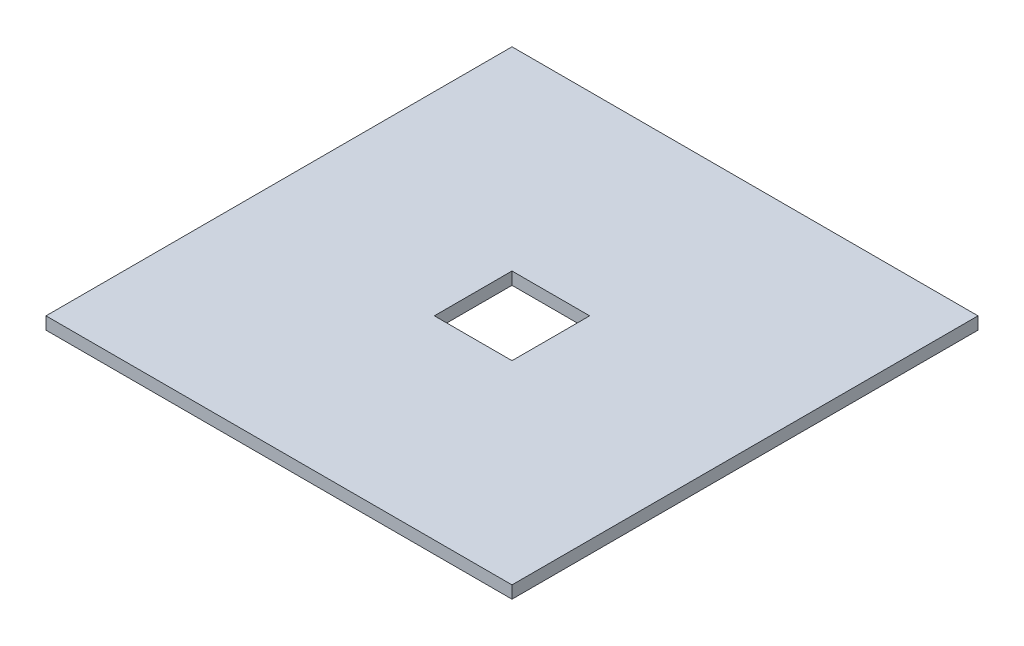
ISO-10303-21;
HEADER;
FILE_DESCRIPTION(('STEP AP214'),'2;1');
FILE_NAME('part.step','',(''),(''),'','','');
FILE_SCHEMA(('AUTOMOTIVE_DESIGN { 1 0 10303 214 1 1 1 1 }'));
ENDSEC;
DATA;
#1=APPLICATION_CONTEXT('core data for automotive mechanical design processes');
#2=APPLICATION_PROTOCOL_DEFINITION('international standard','automotive_design',2000,#1);
#3=PRODUCT_CONTEXT('',#1,'mechanical');
#4=PRODUCT('Part','Part','',(#3));
#5=PRODUCT_RELATED_PRODUCT_CATEGORY('part','',(#4));
#6=PRODUCT_DEFINITION_FORMATION('','',#4);
#7=PRODUCT_DEFINITION_CONTEXT('part definition',#1,'design');
#8=PRODUCT_DEFINITION('design','',#6,#7);
#9=PRODUCT_DEFINITION_SHAPE('','',#8);
#10=(LENGTH_UNIT() NAMED_UNIT(*) SI_UNIT(.MILLI.,.METRE.));
#11=(NAMED_UNIT(*) PLANE_ANGLE_UNIT() SI_UNIT($,.RADIAN.));
#12=(NAMED_UNIT(*) SI_UNIT($,.STERADIAN.) SOLID_ANGLE_UNIT());
#13=UNCERTAINTY_MEASURE_WITH_UNIT(LENGTH_MEASURE(1.E-05),#10,'distance_accuracy_value','');
#14=(GEOMETRIC_REPRESENTATION_CONTEXT(3) GLOBAL_UNCERTAINTY_ASSIGNED_CONTEXT((#13)) GLOBAL_UNIT_ASSIGNED_CONTEXT((#10,
#11,#12)) REPRESENTATION_CONTEXT('',''));
#15=CARTESIAN_POINT('',(0.,0.,0.));
#16=DIRECTION('',(0.,0.,1.));
#17=DIRECTION('',(1.,0.,0.));
#18=AXIS2_PLACEMENT_3D('',#15,#16,#17);
#19=CARTESIAN_POINT('',(150.,8.,150.));
#20=DIRECTION('',(-1.,0.,0.));
#21=DIRECTION('',(0.,0.,1.));
#22=AXIS2_PLACEMENT_3D('',#19,#20,#21);
#23=PLANE('',#22);
#24=DIRECTION('',(0.,0.,-1.));
#25=VECTOR('',#24,1.);
#26=CARTESIAN_POINT('',(150.,0.,150.));
#27=LINE('',#26,#25);
#28=CARTESIAN_POINT('',(150.,0.,150.));
#29=VERTEX_POINT('',#28);
#30=CARTESIAN_POINT('',(150.,0.,-150.));
#31=VERTEX_POINT('',#30);
#32=EDGE_CURVE('E122',#29,#31,#27,.T.);
#33=ORIENTED_EDGE('',*,*,#32,.T.);
#34=DIRECTION('',(0.,-1.,0.));
#35=VECTOR('',#34,1.);
#36=CARTESIAN_POINT('',(150.,8.,-150.));
#37=LINE('',#36,#35);
#38=CARTESIAN_POINT('',(150.,8.,-150.));
#39=VERTEX_POINT('',#38);
#40=EDGE_CURVE('E151',#39,#31,#37,.T.);
#41=ORIENTED_EDGE('',*,*,#40,.F.);
#42=DIRECTION('',(0.,0.,-1.));
#43=VECTOR('',#42,1.);
#44=CARTESIAN_POINT('',(150.,8.,150.));
#45=LINE('',#44,#43);
#46=CARTESIAN_POINT('',(150.,8.,150.));
#47=VERTEX_POINT('',#46);
#48=EDGE_CURVE('E125',#47,#39,#45,.T.);
#49=ORIENTED_EDGE('',*,*,#48,.F.);
#50=DIRECTION('',(0.,-1.,0.));
#51=VECTOR('',#50,1.);
#52=CARTESIAN_POINT('',(150.,8.,150.));
#53=LINE('',#52,#51);
#54=EDGE_CURVE('E135',#47,#29,#53,.T.);
#55=ORIENTED_EDGE('',*,*,#54,.T.);
#56=EDGE_LOOP('',(#33,#41,#49,#55));
#57=FACE_BOUND('',#56,.T.);
#58=ADVANCED_FACE('F33',(#57),#23,.F.);
#59=CARTESIAN_POINT('',(-150.,8.,-150.));
#60=DIRECTION('',(0.,0.,1.));
#61=DIRECTION('',(1.,0.,0.));
#62=AXIS2_PLACEMENT_3D('',#59,#60,#61);
#63=PLANE('',#62);
#64=DIRECTION('',(-1.,0.,0.));
#65=VECTOR('',#64,1.);
#66=CARTESIAN_POINT('',(-150.,0.,-150.));
#67=LINE('',#66,#65);
#68=CARTESIAN_POINT('',(-150.,0.,-150.));
#69=VERTEX_POINT('',#68);
#70=EDGE_CURVE('E138',#31,#69,#67,.T.);
#71=ORIENTED_EDGE('',*,*,#70,.T.);
#72=DIRECTION('',(0.,-1.,0.));
#73=VECTOR('',#72,1.);
#74=CARTESIAN_POINT('',(-150.,8.,-150.));
#75=LINE('',#74,#73);
#76=CARTESIAN_POINT('',(-150.,8.,-150.));
#77=VERTEX_POINT('',#76);
#78=EDGE_CURVE('E148',#77,#69,#75,.T.);
#79=ORIENTED_EDGE('',*,*,#78,.F.);
#80=DIRECTION('',(-1.,0.,0.));
#81=VECTOR('',#80,1.);
#82=CARTESIAN_POINT('',(-150.,8.,-150.));
#83=LINE('',#82,#81);
#84=EDGE_CURVE('E128',#39,#77,#83,.T.);
#85=ORIENTED_EDGE('',*,*,#84,.F.);
#86=ORIENTED_EDGE('',*,*,#40,.T.);
#87=EDGE_LOOP('',(#71,#79,#85,#86));
#88=FACE_BOUND('',#87,.T.);
#89=ADVANCED_FACE('F177',(#88),#63,.F.);
#90=CARTESIAN_POINT('',(-150.,8.,150.));
#91=DIRECTION('',(1.,0.,0.));
#92=DIRECTION('',(0.,0.,-1.));
#93=AXIS2_PLACEMENT_3D('',#90,#91,#92);
#94=PLANE('',#93);
#95=DIRECTION('',(0.,0.,1.));
#96=VECTOR('',#95,1.);
#97=CARTESIAN_POINT('',(-150.,0.,150.));
#98=LINE('',#97,#96);
#99=CARTESIAN_POINT('',(-150.,0.,150.));
#100=VERTEX_POINT('',#99);
#101=EDGE_CURVE('E140',#69,#100,#98,.T.);
#102=ORIENTED_EDGE('',*,*,#101,.T.);
#103=DIRECTION('',(0.,-1.,0.));
#104=VECTOR('',#103,1.);
#105=CARTESIAN_POINT('',(-150.,8.,150.));
#106=LINE('',#105,#104);
#107=CARTESIAN_POINT('',(-150.,8.,150.));
#108=VERTEX_POINT('',#107);
#109=EDGE_CURVE('E145',#108,#100,#106,.T.);
#110=ORIENTED_EDGE('',*,*,#109,.F.);
#111=DIRECTION('',(0.,0.,1.));
#112=VECTOR('',#111,1.);
#113=CARTESIAN_POINT('',(-150.,8.,150.));
#114=LINE('',#113,#112);
#115=EDGE_CURVE('E131',#77,#108,#114,.T.);
#116=ORIENTED_EDGE('',*,*,#115,.F.);
#117=ORIENTED_EDGE('',*,*,#78,.T.);
#118=EDGE_LOOP('',(#102,#110,#116,#117));
#119=FACE_BOUND('',#118,.T.);
#120=ADVANCED_FACE('F182',(#119),#94,.F.);
#121=CARTESIAN_POINT('',(-150.,8.,150.));
#122=DIRECTION('',(0.,0.,-1.));
#123=DIRECTION('',(-1.,0.,0.));
#124=AXIS2_PLACEMENT_3D('',#121,#122,#123);
#125=PLANE('',#124);
#126=DIRECTION('',(1.,0.,0.));
#127=VECTOR('',#126,1.);
#128=CARTESIAN_POINT('',(-150.,0.,150.));
#129=LINE('',#128,#127);
#130=EDGE_CURVE('E129',#100,#29,#129,.T.);
#131=ORIENTED_EDGE('',*,*,#130,.T.);
#132=ORIENTED_EDGE('',*,*,#54,.F.);
#133=DIRECTION('',(1.,0.,0.));
#134=VECTOR('',#133,1.);
#135=CARTESIAN_POINT('',(-150.,8.,150.));
#136=LINE('',#135,#134);
#137=EDGE_CURVE('E133',#108,#47,#136,.T.);
#138=ORIENTED_EDGE('',*,*,#137,.F.);
#139=ORIENTED_EDGE('',*,*,#109,.T.);
#140=EDGE_LOOP('',(#131,#132,#138,#139));
#141=FACE_BOUND('',#140,.T.);
#142=ADVANCED_FACE('F195',(#141),#125,.F.);
#143=CARTESIAN_POINT('',(0.,8.,0.));
#144=DIRECTION('',(0.,-1.,0.));
#145=DIRECTION('',(0.,0.,-1.));
#146=AXIS2_PLACEMENT_3D('',#143,#144,#145);
#147=PLANE('',#146);
#148=DIRECTION('',(-1.,0.,0.));
#149=VECTOR('',#148,1.);
#150=CARTESIAN_POINT('',(-25.,8.,-25.));
#151=LINE('',#150,#149);
#152=CARTESIAN_POINT('',(25.,8.,-25.));
#153=VERTEX_POINT('',#152);
#154=CARTESIAN_POINT('',(-25.,8.,-25.));
#155=VERTEX_POINT('',#154);
#156=EDGE_CURVE('E108',#153,#155,#151,.T.);
#157=ORIENTED_EDGE('',*,*,#156,.F.);
#158=DIRECTION('',(0.,0.,-1.));
#159=VECTOR('',#158,1.);
#160=CARTESIAN_POINT('',(25.,8.,25.));
#161=LINE('',#160,#159);
#162=CARTESIAN_POINT('',(25.,8.,25.));
#163=VERTEX_POINT('',#162);
#164=EDGE_CURVE('E47',#163,#153,#161,.T.);
#165=ORIENTED_EDGE('',*,*,#164,.F.);
#166=DIRECTION('',(1.,0.,0.));
#167=VECTOR('',#166,1.);
#168=CARTESIAN_POINT('',(-25.,8.,25.));
#169=LINE('',#168,#167);
#170=CARTESIAN_POINT('',(-25.,8.,25.));
#171=VERTEX_POINT('',#170);
#172=EDGE_CURVE('E115',#171,#163,#169,.T.);
#173=ORIENTED_EDGE('',*,*,#172,.F.);
#174=DIRECTION('',(0.,0.,1.));
#175=VECTOR('',#174,1.);
#176=CARTESIAN_POINT('',(-25.,8.,25.));
#177=LINE('',#176,#175);
#178=EDGE_CURVE('E99',#155,#171,#177,.T.);
#179=ORIENTED_EDGE('',*,*,#178,.F.);
#180=EDGE_LOOP('',(#157,#165,#173,#179));
#181=FACE_BOUND('',#180,.T.);
#182=ORIENTED_EDGE('',*,*,#48,.T.);
#183=ORIENTED_EDGE('',*,*,#84,.T.);
#184=ORIENTED_EDGE('',*,*,#115,.T.);
#185=ORIENTED_EDGE('',*,*,#137,.T.);
#186=EDGE_LOOP('',(#182,#183,#184,#185));
#187=FACE_BOUND('',#186,.T.);
#188=ADVANCED_FACE('F112',(#181,#187),#147,.F.);
#189=CARTESIAN_POINT('',(0.,0.,0.));
#190=DIRECTION('',(0.,-1.,0.));
#191=DIRECTION('',(0.,0.,-1.));
#192=AXIS2_PLACEMENT_3D('',#189,#190,#191);
#193=PLANE('',#192);
#194=DIRECTION('',(0.,0.,1.));
#195=VECTOR('',#194,1.);
#196=CARTESIAN_POINT('',(25.,0.,0.));
#197=LINE('',#196,#195);
#198=CARTESIAN_POINT('',(25.,0.,-25.));
#199=VERTEX_POINT('',#198);
#200=CARTESIAN_POINT('',(25.,0.,25.));
#201=VERTEX_POINT('',#200);
#202=EDGE_CURVE('E11',#199,#201,#197,.T.);
#203=ORIENTED_EDGE('',*,*,#202,.F.);
#204=DIRECTION('',(1.,0.,0.));
#205=VECTOR('',#204,1.);
#206=CARTESIAN_POINT('',(0.,0.,-25.));
#207=LINE('',#206,#205);
#208=CARTESIAN_POINT('',(-25.,0.,-25.));
#209=VERTEX_POINT('',#208);
#210=EDGE_CURVE('E154',#209,#199,#207,.T.);
#211=ORIENTED_EDGE('',*,*,#210,.F.);
#212=DIRECTION('',(0.,0.,-1.));
#213=VECTOR('',#212,1.);
#214=CARTESIAN_POINT('',(-25.,0.,0.));
#215=LINE('',#214,#213);
#216=CARTESIAN_POINT('',(-25.,0.,25.));
#217=VERTEX_POINT('',#216);
#218=EDGE_CURVE('E102',#217,#209,#215,.T.);
#219=ORIENTED_EDGE('',*,*,#218,.F.);
#220=DIRECTION('',(-1.,0.,0.));
#221=VECTOR('',#220,1.);
#222=CARTESIAN_POINT('',(0.,0.,25.));
#223=LINE('',#222,#221);
#224=EDGE_CURVE('E40',#201,#217,#223,.T.);
#225=ORIENTED_EDGE('',*,*,#224,.F.);
#226=EDGE_LOOP('',(#203,#211,#219,#225));
#227=FACE_BOUND('',#226,.T.);
#228=ORIENTED_EDGE('',*,*,#32,.F.);
#229=ORIENTED_EDGE('',*,*,#130,.F.);
#230=ORIENTED_EDGE('',*,*,#101,.F.);
#231=ORIENTED_EDGE('',*,*,#70,.F.);
#232=EDGE_LOOP('',(#228,#229,#230,#231));
#233=FACE_BOUND('',#232,.T.);
#234=ADVANCED_FACE('F162',(#227,#233),#193,.T.);
#235=CARTESIAN_POINT('',(25.,-2.,25.));
#236=DIRECTION('',(1.,0.,0.));
#237=DIRECTION('',(0.,0.,-1.));
#238=AXIS2_PLACEMENT_3D('',#235,#236,#237);
#239=PLANE('',#238);
#240=ORIENTED_EDGE('',*,*,#202,.T.);
#241=DIRECTION('',(0.,1.,0.));
#242=VECTOR('',#241,1.);
#243=CARTESIAN_POINT('',(25.,-2.,25.));
#244=LINE('',#243,#242);
#245=EDGE_CURVE('E120',#201,#163,#244,.T.);
#246=ORIENTED_EDGE('',*,*,#245,.T.);
#247=ORIENTED_EDGE('',*,*,#164,.T.);
#248=DIRECTION('',(0.,1.,0.));
#249=VECTOR('',#248,1.);
#250=CARTESIAN_POINT('',(25.,-2.,-25.));
#251=LINE('',#250,#249);
#252=EDGE_CURVE('E105',#199,#153,#251,.T.);
#253=ORIENTED_EDGE('',*,*,#252,.F.);
#254=EDGE_LOOP('',(#240,#246,#247,#253));
#255=FACE_BOUND('',#254,.T.);
#256=ADVANCED_FACE('F164',(#255),#239,.F.);
#257=CARTESIAN_POINT('',(-25.,-2.,25.));
#258=DIRECTION('',(0.,0.,1.));
#259=DIRECTION('',(1.,0.,0.));
#260=AXIS2_PLACEMENT_3D('',#257,#258,#259);
#261=PLANE('',#260);
#262=ORIENTED_EDGE('',*,*,#224,.T.);
#263=DIRECTION('',(0.,1.,0.));
#264=VECTOR('',#263,1.);
#265=CARTESIAN_POINT('',(-25.,-2.,25.));
#266=LINE('',#265,#264);
#267=EDGE_CURVE('E104',#217,#171,#266,.T.);
#268=ORIENTED_EDGE('',*,*,#267,.T.);
#269=ORIENTED_EDGE('',*,*,#172,.T.);
#270=ORIENTED_EDGE('',*,*,#245,.F.);
#271=EDGE_LOOP('',(#262,#268,#269,#270));
#272=FACE_BOUND('',#271,.T.);
#273=ADVANCED_FACE('F159',(#272),#261,.F.);
#274=CARTESIAN_POINT('',(-25.,-2.,25.));
#275=DIRECTION('',(-1.,0.,0.));
#276=DIRECTION('',(0.,0.,1.));
#277=AXIS2_PLACEMENT_3D('',#274,#275,#276);
#278=PLANE('',#277);
#279=ORIENTED_EDGE('',*,*,#218,.T.);
#280=DIRECTION('',(0.,1.,0.));
#281=VECTOR('',#280,1.);
#282=CARTESIAN_POINT('',(-25.,-2.,-25.));
#283=LINE('',#282,#281);
#284=EDGE_CURVE('E55',#209,#155,#283,.T.);
#285=ORIENTED_EDGE('',*,*,#284,.T.);
#286=ORIENTED_EDGE('',*,*,#178,.T.);
#287=ORIENTED_EDGE('',*,*,#267,.F.);
#288=EDGE_LOOP('',(#279,#285,#286,#287));
#289=FACE_BOUND('',#288,.T.);
#290=ADVANCED_FACE('F96',(#289),#278,.F.);
#291=CARTESIAN_POINT('',(-25.,-2.,-25.));
#292=DIRECTION('',(0.,0.,-1.));
#293=DIRECTION('',(-1.,0.,0.));
#294=AXIS2_PLACEMENT_3D('',#291,#292,#293);
#295=PLANE('',#294);
#296=ORIENTED_EDGE('',*,*,#210,.T.);
#297=ORIENTED_EDGE('',*,*,#252,.T.);
#298=ORIENTED_EDGE('',*,*,#156,.T.);
#299=ORIENTED_EDGE('',*,*,#284,.F.);
#300=EDGE_LOOP('',(#296,#297,#298,#299));
#301=FACE_BOUND('',#300,.T.);
#302=ADVANCED_FACE('F109',(#301),#295,.F.);
#303=CLOSED_SHELL('',(#58,#89,#120,#142,#188,#234,#256,#273,#290,#302));
#304=MANIFOLD_SOLID_BREP('B2',#303);
#305=ADVANCED_BREP_SHAPE_REPRESENTATION('',(#18,#304),#14);
#306=SHAPE_DEFINITION_REPRESENTATION(#9,#305);
ENDSEC;
END-ISO-10303-21;
